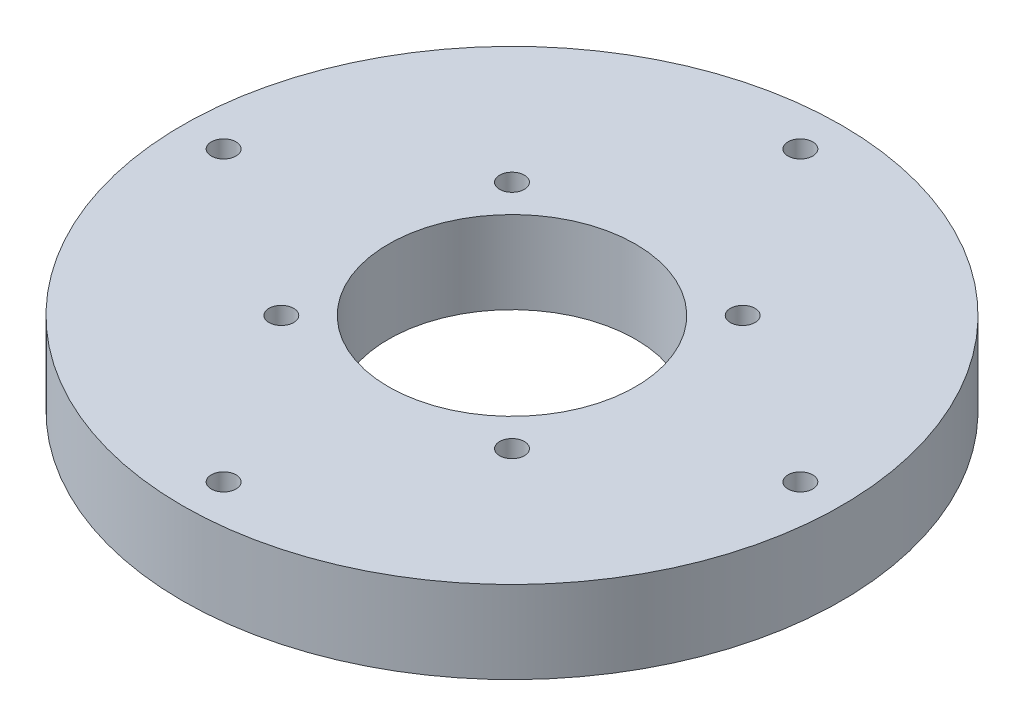
ISO-10303-21;
HEADER;
FILE_DESCRIPTION(('STEP AP214'),'2;1');
FILE_NAME('part.step','',(''),(''),'','','');
FILE_SCHEMA(('AUTOMOTIVE_DESIGN { 1 0 10303 214 1 1 1 1 }'));
ENDSEC;
DATA;
#1=APPLICATION_CONTEXT('core data for automotive mechanical design processes');
#2=APPLICATION_PROTOCOL_DEFINITION('international standard','automotive_design',2000,#1);
#3=PRODUCT_CONTEXT('',#1,'mechanical');
#4=PRODUCT('Part','Part','',(#3));
#5=PRODUCT_RELATED_PRODUCT_CATEGORY('part','',(#4));
#6=PRODUCT_DEFINITION_FORMATION('','',#4);
#7=PRODUCT_DEFINITION_CONTEXT('part definition',#1,'design');
#8=PRODUCT_DEFINITION('design','',#6,#7);
#9=PRODUCT_DEFINITION_SHAPE('','',#8);
#10=(LENGTH_UNIT() NAMED_UNIT(*) SI_UNIT(.MILLI.,.METRE.));
#11=(NAMED_UNIT(*) PLANE_ANGLE_UNIT() SI_UNIT($,.RADIAN.));
#12=(NAMED_UNIT(*) SI_UNIT($,.STERADIAN.) SOLID_ANGLE_UNIT());
#13=UNCERTAINTY_MEASURE_WITH_UNIT(LENGTH_MEASURE(1.E-05),#10,'distance_accuracy_value','');
#14=(GEOMETRIC_REPRESENTATION_CONTEXT(3) GLOBAL_UNCERTAINTY_ASSIGNED_CONTEXT((#13)) GLOBAL_UNIT_ASSIGNED_CONTEXT((#10,
#11,#12)) REPRESENTATION_CONTEXT('',''));
#15=CARTESIAN_POINT('',(0.,0.,0.));
#16=DIRECTION('',(0.,0.,1.));
#17=DIRECTION('',(1.,0.,0.));
#18=AXIS2_PLACEMENT_3D('',#15,#16,#17);
#19=CARTESIAN_POINT('',(0.,5.,0.));
#20=DIRECTION('',(0.,-1.,0.));
#21=DIRECTION('',(0.,0.,-1.));
#22=AXIS2_PLACEMENT_3D('',#19,#20,#21);
#23=PLANE('',#22);
#24=CARTESIAN_POINT('',(0.,5.,0.));
#25=DIRECTION('',(0.,1.,0.));
#26=DIRECTION('',(0.,0.,1.));
#27=AXIS2_PLACEMENT_3D('',#24,#25,#26);
#28=CIRCLE('',#27,7.5);
#29=CARTESIAN_POINT('',(0.,5.,7.5));
#30=VERTEX_POINT('',#29);
#31=EDGE_CURVE('E11',#30,#30,#28,.T.);
#32=ORIENTED_EDGE('',*,*,#31,.F.);
#33=EDGE_LOOP('',(#32));
#34=FACE_BOUND('',#33,.T.);
#35=CARTESIAN_POINT('',(7.,5.,7.));
#36=DIRECTION('',(0.,-1.,0.));
#37=DIRECTION('',(0.,0.,-1.));
#38=AXIS2_PLACEMENT_3D('',#35,#36,#37);
#39=CIRCLE('',#38,0.749999999999999);
#40=CARTESIAN_POINT('',(7.,5.,6.25));
#41=VERTEX_POINT('',#40);
#42=EDGE_CURVE('E49',#41,#41,#39,.T.);
#43=ORIENTED_EDGE('',*,*,#42,.T.);
#44=EDGE_LOOP('',(#43));
#45=FACE_BOUND('',#44,.T.);
#46=CARTESIAN_POINT('',(7.,5.,-7.));
#47=DIRECTION('',(0.,-1.,0.));
#48=DIRECTION('',(0.,0.,-1.));
#49=AXIS2_PLACEMENT_3D('',#46,#47,#48);
#50=CIRCLE('',#49,0.749999999999999);
#51=CARTESIAN_POINT('',(7.,5.,-7.75));
#52=VERTEX_POINT('',#51);
#53=EDGE_CURVE('E70',#52,#52,#50,.T.);
#54=ORIENTED_EDGE('',*,*,#53,.T.);
#55=EDGE_LOOP('',(#54));
#56=FACE_BOUND('',#55,.T.);
#57=CARTESIAN_POINT('',(-7.,5.,-7.));
#58=DIRECTION('',(0.,-1.,0.));
#59=DIRECTION('',(0.,0.,-1.));
#60=AXIS2_PLACEMENT_3D('',#57,#58,#59);
#61=CIRCLE('',#60,0.75);
#62=CARTESIAN_POINT('',(-7.,5.,-7.75));
#63=VERTEX_POINT('',#62);
#64=EDGE_CURVE('E64',#63,#63,#61,.T.);
#65=ORIENTED_EDGE('',*,*,#64,.T.);
#66=EDGE_LOOP('',(#65));
#67=FACE_BOUND('',#66,.T.);
#68=CARTESIAN_POINT('',(-7.,5.,7.));
#69=DIRECTION('',(0.,-1.,0.));
#70=DIRECTION('',(0.,0.,-1.));
#71=AXIS2_PLACEMENT_3D('',#68,#69,#70);
#72=CIRCLE('',#71,0.749999999999999);
#73=CARTESIAN_POINT('',(-7.,5.,6.25));
#74=VERTEX_POINT('',#73);
#75=EDGE_CURVE('E57',#74,#74,#72,.T.);
#76=ORIENTED_EDGE('',*,*,#75,.T.);
#77=EDGE_LOOP('',(#76));
#78=FACE_BOUND('',#77,.T.);
#79=CARTESIAN_POINT('',(0.,5.,17.5));
#80=DIRECTION('',(0.,1.,0.));
#81=DIRECTION('',(0.,0.,1.));
#82=AXIS2_PLACEMENT_3D('',#79,#80,#81);
#83=CIRCLE('',#82,0.75);
#84=CARTESIAN_POINT('',(0.,5.,18.25));
#85=VERTEX_POINT('',#84);
#86=EDGE_CURVE('E78',#85,#85,#83,.T.);
#87=ORIENTED_EDGE('',*,*,#86,.F.);
#88=EDGE_LOOP('',(#87));
#89=FACE_BOUND('',#88,.T.);
#90=CARTESIAN_POINT('',(-17.5,5.,0.));
#91=DIRECTION('',(0.,1.,0.));
#92=DIRECTION('',(0.,0.,1.));
#93=AXIS2_PLACEMENT_3D('',#90,#91,#92);
#94=CIRCLE('',#93,0.750000000000002);
#95=CARTESIAN_POINT('',(-17.5,5.,0.750000000000002));
#96=VERTEX_POINT('',#95);
#97=EDGE_CURVE('E85',#96,#96,#94,.T.);
#98=ORIENTED_EDGE('',*,*,#97,.F.);
#99=EDGE_LOOP('',(#98));
#100=FACE_BOUND('',#99,.T.);
#101=CARTESIAN_POINT('',(0.,5.,-17.5));
#102=DIRECTION('',(0.,1.,0.));
#103=DIRECTION('',(0.,0.,1.));
#104=AXIS2_PLACEMENT_3D('',#101,#102,#103);
#105=CIRCLE('',#104,0.75);
#106=CARTESIAN_POINT('',(0.,5.,-16.75));
#107=VERTEX_POINT('',#106);
#108=EDGE_CURVE('E91',#107,#107,#105,.T.);
#109=ORIENTED_EDGE('',*,*,#108,.F.);
#110=EDGE_LOOP('',(#109));
#111=FACE_BOUND('',#110,.T.);
#112=CARTESIAN_POINT('',(17.5,5.,0.));
#113=DIRECTION('',(0.,1.,0.));
#114=DIRECTION('',(0.,0.,1.));
#115=AXIS2_PLACEMENT_3D('',#112,#113,#114);
#116=CIRCLE('',#115,0.750000000000002);
#117=CARTESIAN_POINT('',(17.5,5.,0.750000000000002));
#118=VERTEX_POINT('',#117);
#119=EDGE_CURVE('E94',#118,#118,#116,.T.);
#120=ORIENTED_EDGE('',*,*,#119,.F.);
#121=EDGE_LOOP('',(#120));
#122=FACE_BOUND('',#121,.T.);
#123=CARTESIAN_POINT('',(0.,5.,0.));
#124=DIRECTION('',(0.,1.,0.));
#125=DIRECTION('',(0.,0.,1.));
#126=AXIS2_PLACEMENT_3D('',#123,#124,#125);
#127=CIRCLE('',#126,20.);
#128=CARTESIAN_POINT('',(0.,5.,20.));
#129=VERTEX_POINT('',#128);
#130=EDGE_CURVE('E99',#129,#129,#127,.T.);
#131=ORIENTED_EDGE('',*,*,#130,.T.);
#132=EDGE_LOOP('',(#131));
#133=FACE_BOUND('',#132,.T.);
#134=ADVANCED_FACE('F38',(#34,#45,#56,#67,#78,#89,#100,#111,#122,#133),#23,.F.);
#135=CARTESIAN_POINT('',(0.,0.,0.));
#136=DIRECTION('',(0.,-1.,0.));
#137=DIRECTION('',(0.,0.,-1.));
#138=AXIS2_PLACEMENT_3D('',#135,#136,#137);
#139=PLANE('',#138);
#140=CARTESIAN_POINT('',(0.,0.,0.));
#141=DIRECTION('',(0.,1.,0.));
#142=DIRECTION('',(0.,0.,1.));
#143=AXIS2_PLACEMENT_3D('',#140,#141,#142);
#144=CIRCLE('',#143,7.5);
#145=CARTESIAN_POINT('',(0.,0.,7.5));
#146=VERTEX_POINT('',#145);
#147=EDGE_CURVE('E42',#146,#146,#144,.T.);
#148=ORIENTED_EDGE('',*,*,#147,.T.);
#149=EDGE_LOOP('',(#148));
#150=FACE_BOUND('',#149,.T.);
#151=CARTESIAN_POINT('',(7.,0.,7.));
#152=DIRECTION('',(0.,-1.,0.));
#153=DIRECTION('',(0.,0.,-1.));
#154=AXIS2_PLACEMENT_3D('',#151,#152,#153);
#155=CIRCLE('',#154,0.749999999999999);
#156=CARTESIAN_POINT('',(7.,0.,6.25));
#157=VERTEX_POINT('',#156);
#158=EDGE_CURVE('E51',#157,#157,#155,.T.);
#159=ORIENTED_EDGE('',*,*,#158,.F.);
#160=EDGE_LOOP('',(#159));
#161=FACE_BOUND('',#160,.T.);
#162=CARTESIAN_POINT('',(7.,0.,-7.));
#163=DIRECTION('',(0.,-1.,0.));
#164=DIRECTION('',(0.,0.,-1.));
#165=AXIS2_PLACEMENT_3D('',#162,#163,#164);
#166=CIRCLE('',#165,0.749999999999999);
#167=CARTESIAN_POINT('',(7.,0.,-7.75));
#168=VERTEX_POINT('',#167);
#169=EDGE_CURVE('E54',#168,#168,#166,.T.);
#170=ORIENTED_EDGE('',*,*,#169,.F.);
#171=EDGE_LOOP('',(#170));
#172=FACE_BOUND('',#171,.T.);
#173=CARTESIAN_POINT('',(-7.,0.,-7.));
#174=DIRECTION('',(0.,-1.,0.));
#175=DIRECTION('',(0.,0.,-1.));
#176=AXIS2_PLACEMENT_3D('',#173,#174,#175);
#177=CIRCLE('',#176,0.75);
#178=CARTESIAN_POINT('',(-7.,0.,-7.75));
#179=VERTEX_POINT('',#178);
#180=EDGE_CURVE('E67',#179,#179,#177,.T.);
#181=ORIENTED_EDGE('',*,*,#180,.F.);
#182=EDGE_LOOP('',(#181));
#183=FACE_BOUND('',#182,.T.);
#184=CARTESIAN_POINT('',(-7.,0.,7.));
#185=DIRECTION('',(0.,-1.,0.));
#186=DIRECTION('',(0.,0.,-1.));
#187=AXIS2_PLACEMENT_3D('',#184,#185,#186);
#188=CIRCLE('',#187,0.749999999999999);
#189=CARTESIAN_POINT('',(-7.,0.,6.25));
#190=VERTEX_POINT('',#189);
#191=EDGE_CURVE('E60',#190,#190,#188,.T.);
#192=ORIENTED_EDGE('',*,*,#191,.F.);
#193=EDGE_LOOP('',(#192));
#194=FACE_BOUND('',#193,.T.);
#195=CARTESIAN_POINT('',(0.,0.,17.5));
#196=DIRECTION('',(0.,1.,0.));
#197=DIRECTION('',(0.,0.,1.));
#198=AXIS2_PLACEMENT_3D('',#195,#196,#197);
#199=CIRCLE('',#198,0.75);
#200=CARTESIAN_POINT('',(0.,0.,18.25));
#201=VERTEX_POINT('',#200);
#202=EDGE_CURVE('E75',#201,#201,#199,.T.);
#203=ORIENTED_EDGE('',*,*,#202,.T.);
#204=EDGE_LOOP('',(#203));
#205=FACE_BOUND('',#204,.T.);
#206=CARTESIAN_POINT('',(-17.5,0.,0.));
#207=DIRECTION('',(0.,1.,0.));
#208=DIRECTION('',(0.,0.,1.));
#209=AXIS2_PLACEMENT_3D('',#206,#207,#208);
#210=CIRCLE('',#209,0.750000000000002);
#211=CARTESIAN_POINT('',(-17.5,0.,0.750000000000002));
#212=VERTEX_POINT('',#211);
#213=EDGE_CURVE('E82',#212,#212,#210,.T.);
#214=ORIENTED_EDGE('',*,*,#213,.T.);
#215=EDGE_LOOP('',(#214));
#216=FACE_BOUND('',#215,.T.);
#217=CARTESIAN_POINT('',(0.,0.,-17.5));
#218=DIRECTION('',(0.,1.,0.));
#219=DIRECTION('',(0.,0.,1.));
#220=AXIS2_PLACEMENT_3D('',#217,#218,#219);
#221=CIRCLE('',#220,0.75);
#222=CARTESIAN_POINT('',(0.,0.,-16.75));
#223=VERTEX_POINT('',#222);
#224=EDGE_CURVE('E88',#223,#223,#221,.T.);
#225=ORIENTED_EDGE('',*,*,#224,.T.);
#226=EDGE_LOOP('',(#225));
#227=FACE_BOUND('',#226,.T.);
#228=CARTESIAN_POINT('',(17.5,0.,0.));
#229=DIRECTION('',(0.,1.,0.));
#230=DIRECTION('',(0.,0.,1.));
#231=AXIS2_PLACEMENT_3D('',#228,#229,#230);
#232=CIRCLE('',#231,0.750000000000002);
#233=CARTESIAN_POINT('',(17.5,0.,0.750000000000002));
#234=VERTEX_POINT('',#233);
#235=EDGE_CURVE('E61',#234,#234,#232,.T.);
#236=ORIENTED_EDGE('',*,*,#235,.T.);
#237=EDGE_LOOP('',(#236));
#238=FACE_BOUND('',#237,.T.);
#239=CARTESIAN_POINT('',(0.,0.,0.));
#240=DIRECTION('',(0.,1.,0.));
#241=DIRECTION('',(0.,0.,1.));
#242=AXIS2_PLACEMENT_3D('',#239,#240,#241);
#243=CIRCLE('',#242,20.);
#244=CARTESIAN_POINT('',(0.,0.,20.));
#245=VERTEX_POINT('',#244);
#246=EDGE_CURVE('E79',#245,#245,#243,.T.);
#247=ORIENTED_EDGE('',*,*,#246,.F.);
#248=EDGE_LOOP('',(#247));
#249=FACE_BOUND('',#248,.T.);
#250=ADVANCED_FACE('F40',(#150,#161,#172,#183,#194,#205,#216,#227,#238,#249),#139,.T.);
#251=CARTESIAN_POINT('',(0.,5.,0.));
#252=DIRECTION('',(0.,-1.,0.));
#253=DIRECTION('',(0.,0.,-1.));
#254=AXIS2_PLACEMENT_3D('',#251,#252,#253);
#255=CYLINDRICAL_SURFACE('',#254,7.5);
#256=ORIENTED_EDGE('',*,*,#31,.T.);
#257=EDGE_LOOP('',(#256));
#258=FACE_BOUND('',#257,.T.);
#259=ORIENTED_EDGE('',*,*,#147,.F.);
#260=EDGE_LOOP('',(#259));
#261=FACE_BOUND('',#260,.T.);
#262=ADVANCED_FACE('F109',(#258,#261),#255,.F.);
#263=CARTESIAN_POINT('',(7.,5.,7.));
#264=DIRECTION('',(0.,-1.,0.));
#265=DIRECTION('',(0.,0.,-1.));
#266=AXIS2_PLACEMENT_3D('',#263,#264,#265);
#267=CYLINDRICAL_SURFACE('',#266,0.749999999999999);
#268=ORIENTED_EDGE('',*,*,#42,.F.);
#269=EDGE_LOOP('',(#268));
#270=FACE_BOUND('',#269,.T.);
#271=ORIENTED_EDGE('',*,*,#158,.T.);
#272=EDGE_LOOP('',(#271));
#273=FACE_BOUND('',#272,.T.);
#274=ADVANCED_FACE('F115',(#270,#273),#267,.F.);
#275=CARTESIAN_POINT('',(7.,5.,-7.));
#276=DIRECTION('',(0.,-1.,0.));
#277=DIRECTION('',(0.,0.,-1.));
#278=AXIS2_PLACEMENT_3D('',#275,#276,#277);
#279=CYLINDRICAL_SURFACE('',#278,0.749999999999999);
#280=ORIENTED_EDGE('',*,*,#53,.F.);
#281=EDGE_LOOP('',(#280));
#282=FACE_BOUND('',#281,.T.);
#283=ORIENTED_EDGE('',*,*,#169,.T.);
#284=EDGE_LOOP('',(#283));
#285=FACE_BOUND('',#284,.T.);
#286=ADVANCED_FACE('F162',(#282,#285),#279,.F.);
#287=CARTESIAN_POINT('',(-7.,5.,-7.));
#288=DIRECTION('',(0.,-1.,0.));
#289=DIRECTION('',(0.,0.,-1.));
#290=AXIS2_PLACEMENT_3D('',#287,#288,#289);
#291=CYLINDRICAL_SURFACE('',#290,0.75);
#292=ORIENTED_EDGE('',*,*,#64,.F.);
#293=EDGE_LOOP('',(#292));
#294=FACE_BOUND('',#293,.T.);
#295=ORIENTED_EDGE('',*,*,#180,.T.);
#296=EDGE_LOOP('',(#295));
#297=FACE_BOUND('',#296,.T.);
#298=ADVANCED_FACE('F165',(#294,#297),#291,.F.);
#299=CARTESIAN_POINT('',(-7.,5.,7.));
#300=DIRECTION('',(0.,-1.,0.));
#301=DIRECTION('',(0.,0.,-1.));
#302=AXIS2_PLACEMENT_3D('',#299,#300,#301);
#303=CYLINDRICAL_SURFACE('',#302,0.749999999999999);
#304=ORIENTED_EDGE('',*,*,#75,.F.);
#305=EDGE_LOOP('',(#304));
#306=FACE_BOUND('',#305,.T.);
#307=ORIENTED_EDGE('',*,*,#191,.T.);
#308=EDGE_LOOP('',(#307));
#309=FACE_BOUND('',#308,.T.);
#310=ADVANCED_FACE('F160',(#306,#309),#303,.F.);
#311=CARTESIAN_POINT('',(0.,0.,17.5));
#312=DIRECTION('',(0.,1.,0.));
#313=DIRECTION('',(0.,0.,1.));
#314=AXIS2_PLACEMENT_3D('',#311,#312,#313);
#315=CYLINDRICAL_SURFACE('',#314,0.75);
#316=ORIENTED_EDGE('',*,*,#202,.F.);
#317=EDGE_LOOP('',(#316));
#318=FACE_BOUND('',#317,.T.);
#319=ORIENTED_EDGE('',*,*,#86,.T.);
#320=EDGE_LOOP('',(#319));
#321=FACE_BOUND('',#320,.T.);
#322=ADVANCED_FACE('F156',(#318,#321),#315,.F.);
#323=CARTESIAN_POINT('',(-17.5,0.,0.));
#324=DIRECTION('',(0.,1.,0.));
#325=DIRECTION('',(0.,0.,1.));
#326=AXIS2_PLACEMENT_3D('',#323,#324,#325);
#327=CYLINDRICAL_SURFACE('',#326,0.750000000000002);
#328=ORIENTED_EDGE('',*,*,#213,.F.);
#329=EDGE_LOOP('',(#328));
#330=FACE_BOUND('',#329,.T.);
#331=ORIENTED_EDGE('',*,*,#97,.T.);
#332=EDGE_LOOP('',(#331));
#333=FACE_BOUND('',#332,.T.);
#334=ADVANCED_FACE('F152',(#330,#333),#327,.F.);
#335=CARTESIAN_POINT('',(0.,0.,-17.5));
#336=DIRECTION('',(0.,1.,0.));
#337=DIRECTION('',(0.,0.,1.));
#338=AXIS2_PLACEMENT_3D('',#335,#336,#337);
#339=CYLINDRICAL_SURFACE('',#338,0.75);
#340=ORIENTED_EDGE('',*,*,#224,.F.);
#341=EDGE_LOOP('',(#340));
#342=FACE_BOUND('',#341,.T.);
#343=ORIENTED_EDGE('',*,*,#108,.T.);
#344=EDGE_LOOP('',(#343));
#345=FACE_BOUND('',#344,.T.);
#346=ADVANCED_FACE('F139',(#342,#345),#339,.F.);
#347=CARTESIAN_POINT('',(17.5,0.,0.));
#348=DIRECTION('',(0.,1.,0.));
#349=DIRECTION('',(0.,0.,1.));
#350=AXIS2_PLACEMENT_3D('',#347,#348,#349);
#351=CYLINDRICAL_SURFACE('',#350,0.750000000000002);
#352=ORIENTED_EDGE('',*,*,#235,.F.);
#353=EDGE_LOOP('',(#352));
#354=FACE_BOUND('',#353,.T.);
#355=ORIENTED_EDGE('',*,*,#119,.T.);
#356=EDGE_LOOP('',(#355));
#357=FACE_BOUND('',#356,.T.);
#358=ADVANCED_FACE('F136',(#354,#357),#351,.F.);
#359=CARTESIAN_POINT('',(0.,0.,0.));
#360=DIRECTION('',(0.,1.,0.));
#361=DIRECTION('',(0.,0.,1.));
#362=AXIS2_PLACEMENT_3D('',#359,#360,#361);
#363=CYLINDRICAL_SURFACE('',#362,20.);
#364=ORIENTED_EDGE('',*,*,#246,.T.);
#365=EDGE_LOOP('',(#364));
#366=FACE_BOUND('',#365,.T.);
#367=ORIENTED_EDGE('',*,*,#130,.F.);
#368=EDGE_LOOP('',(#367));
#369=FACE_BOUND('',#368,.T.);
#370=ADVANCED_FACE('F105',(#366,#369),#363,.T.);
#371=CLOSED_SHELL('',(#134,#250,#262,#274,#286,#298,#310,#322,#334,#346,#358,#370));
#372=MANIFOLD_SOLID_BREP('B2',#371);
#373=ADVANCED_BREP_SHAPE_REPRESENTATION('',(#18,#372),#14);
#374=SHAPE_DEFINITION_REPRESENTATION(#9,#373);
ENDSEC;
END-ISO-10303-21;
